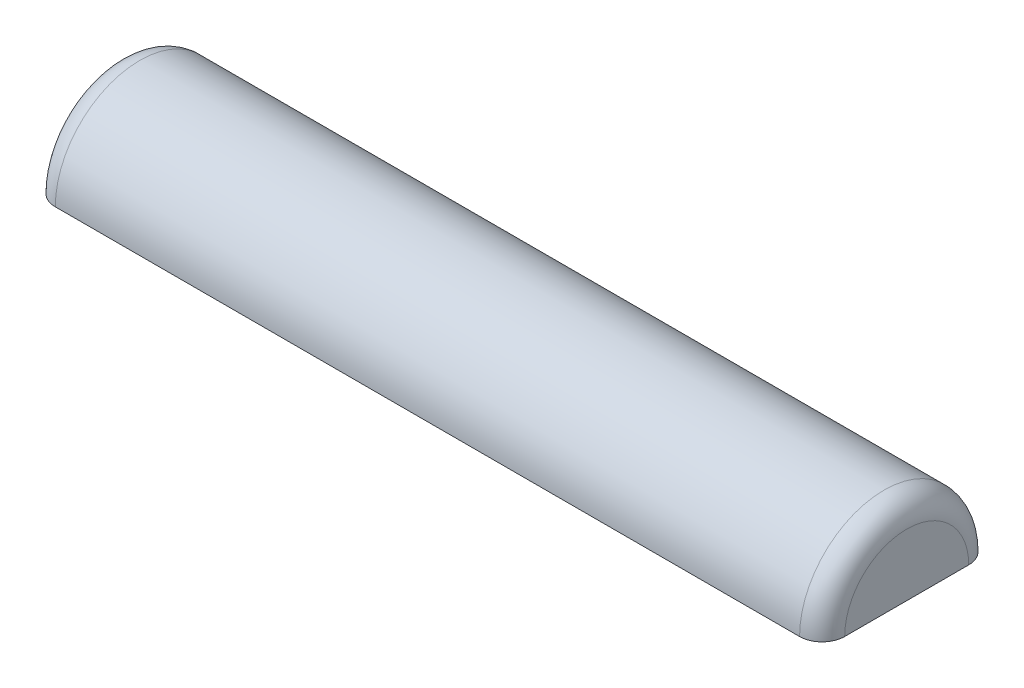
ISO-10303-21;
HEADER;
FILE_DESCRIPTION(('STEP AP214'),'2;1');
FILE_NAME('part.step','',(''),(''),'','','');
FILE_SCHEMA(('AUTOMOTIVE_DESIGN { 1 0 10303 214 1 1 1 1 }'));
ENDSEC;
DATA;
#1=APPLICATION_CONTEXT('core data for automotive mechanical design processes');
#2=APPLICATION_PROTOCOL_DEFINITION('international standard','automotive_design',2000,#1);
#3=PRODUCT_CONTEXT('',#1,'mechanical');
#4=PRODUCT('Part','Part','',(#3));
#5=PRODUCT_RELATED_PRODUCT_CATEGORY('part','',(#4));
#6=PRODUCT_DEFINITION_FORMATION('','',#4);
#7=PRODUCT_DEFINITION_CONTEXT('part definition',#1,'design');
#8=PRODUCT_DEFINITION('design','',#6,#7);
#9=PRODUCT_DEFINITION_SHAPE('','',#8);
#10=(LENGTH_UNIT() NAMED_UNIT(*) SI_UNIT(.MILLI.,.METRE.));
#11=(NAMED_UNIT(*) PLANE_ANGLE_UNIT() SI_UNIT($,.RADIAN.));
#12=(NAMED_UNIT(*) SI_UNIT($,.STERADIAN.) SOLID_ANGLE_UNIT());
#13=UNCERTAINTY_MEASURE_WITH_UNIT(LENGTH_MEASURE(1.E-05),#10,'distance_accuracy_value','');
#14=(GEOMETRIC_REPRESENTATION_CONTEXT(3) GLOBAL_UNCERTAINTY_ASSIGNED_CONTEXT((#13)) GLOBAL_UNIT_ASSIGNED_CONTEXT((#10,
#11,#12)) REPRESENTATION_CONTEXT('',''));
#15=CARTESIAN_POINT('',(0.,0.,0.));
#16=DIRECTION('',(0.,0.,1.));
#17=DIRECTION('',(1.,0.,0.));
#18=AXIS2_PLACEMENT_3D('',#15,#16,#17);
#19=CARTESIAN_POINT('',(0.7,0.,-0.075));
#20=DIRECTION('',(-1.,0.,0.));
#21=DIRECTION('',(0.,0.,1.));
#22=AXIS2_PLACEMENT_3D('',#19,#20,#21);
#23=CYLINDRICAL_SURFACE('',#22,0.075);
#24=DIRECTION('',(-1.,0.,0.));
#25=VECTOR('',#24,1.);
#26=CARTESIAN_POINT('',(0.7,0.,0.));
#27=LINE('',#26,#25);
#28=CARTESIAN_POINT('',(0.68,0.,0.));
#29=VERTEX_POINT('',#28);
#30=CARTESIAN_POINT('',(0.0200000000000001,0.,0.));
#31=VERTEX_POINT('',#30);
#32=EDGE_CURVE('E96',#29,#31,#27,.T.);
#33=ORIENTED_EDGE('',*,*,#32,.F.);
#34=CARTESIAN_POINT('',(0.68,0.,-0.075));
#35=DIRECTION('',(-1.,0.,0.));
#36=DIRECTION('',(0.,0.,1.));
#37=AXIS2_PLACEMENT_3D('',#34,#35,#36);
#38=CIRCLE('',#37,0.075);
#39=CARTESIAN_POINT('',(0.68,0.,-0.15));
#40=VERTEX_POINT('',#39);
#41=EDGE_CURVE('E48',#29,#40,#38,.T.);
#42=ORIENTED_EDGE('',*,*,#41,.T.);
#43=DIRECTION('',(-1.,0.,0.));
#44=VECTOR('',#43,1.);
#45=CARTESIAN_POINT('',(0.7,0.,-0.15));
#46=LINE('',#45,#44);
#47=CARTESIAN_POINT('',(0.0200000000000001,0.,-0.15));
#48=VERTEX_POINT('',#47);
#49=EDGE_CURVE('E101',#40,#48,#46,.T.);
#50=ORIENTED_EDGE('',*,*,#49,.T.);
#51=CARTESIAN_POINT('',(0.0200000000000001,0.,-0.075));
#52=DIRECTION('',(-1.,0.,0.));
#53=DIRECTION('',(0.,0.,1.));
#54=AXIS2_PLACEMENT_3D('',#51,#52,#53);
#55=CIRCLE('',#54,0.075);
#56=EDGE_CURVE('E87',#48,#31,#55,.F.);
#57=ORIENTED_EDGE('',*,*,#56,.T.);
#58=EDGE_LOOP('',(#33,#42,#50,#57));
#59=FACE_BOUND('',#58,.T.);
#60=ADVANCED_FACE('F39',(#59),#23,.T.);
#61=CARTESIAN_POINT('',(0.7,0.,0.));
#62=DIRECTION('',(0.,1.,0.));
#63=DIRECTION('',(0.,0.,1.));
#64=AXIS2_PLACEMENT_3D('',#61,#62,#63);
#65=PLANE('',#64);
#66=DIRECTION('',(0.,0.,-1.));
#67=VECTOR('',#66,1.);
#68=CARTESIAN_POINT('',(0.7,0.,0.));
#69=LINE('',#68,#67);
#70=CARTESIAN_POINT('',(0.7,0.,-0.02));
#71=VERTEX_POINT('',#70);
#72=CARTESIAN_POINT('',(0.7,0.,-0.13));
#73=VERTEX_POINT('',#72);
#74=EDGE_CURVE('E93',#71,#73,#69,.T.);
#75=ORIENTED_EDGE('',*,*,#74,.F.);
#76=CARTESIAN_POINT('',(0.68,0.,-0.02));
#77=DIRECTION('',(0.,1.,0.));
#78=DIRECTION('',(0.,0.,1.));
#79=AXIS2_PLACEMENT_3D('',#76,#77,#78);
#80=CIRCLE('',#79,0.02);
#81=EDGE_CURVE('E63',#71,#29,#80,.F.);
#82=ORIENTED_EDGE('',*,*,#81,.T.);
#83=ORIENTED_EDGE('',*,*,#32,.T.);
#84=CARTESIAN_POINT('',(0.0200000000000001,0.,-0.02));
#85=DIRECTION('',(0.,1.,0.));
#86=DIRECTION('',(0.,0.,1.));
#87=AXIS2_PLACEMENT_3D('',#84,#85,#86);
#88=CIRCLE('',#87,0.02);
#89=CARTESIAN_POINT('',(0.,0.,-0.02));
#90=VERTEX_POINT('',#89);
#91=EDGE_CURVE('E55',#31,#90,#88,.F.);
#92=ORIENTED_EDGE('',*,*,#91,.T.);
#93=DIRECTION('',(0.,0.,-1.));
#94=VECTOR('',#93,1.);
#95=CARTESIAN_POINT('',(0.,0.,0.));
#96=LINE('',#95,#94);
#97=CARTESIAN_POINT('',(0.,0.,-0.13));
#98=VERTEX_POINT('',#97);
#99=EDGE_CURVE('E102',#90,#98,#96,.T.);
#100=ORIENTED_EDGE('',*,*,#99,.T.);
#101=CARTESIAN_POINT('',(0.0200000000000001,0.,-0.13));
#102=DIRECTION('',(0.,1.,0.));
#103=DIRECTION('',(0.,0.,1.));
#104=AXIS2_PLACEMENT_3D('',#101,#102,#103);
#105=CIRCLE('',#104,0.02);
#106=EDGE_CURVE('E95',#98,#48,#105,.F.);
#107=ORIENTED_EDGE('',*,*,#106,.T.);
#108=ORIENTED_EDGE('',*,*,#49,.F.);
#109=CARTESIAN_POINT('',(0.68,0.,-0.13));
#110=DIRECTION('',(0.,1.,0.));
#111=DIRECTION('',(0.,0.,1.));
#112=AXIS2_PLACEMENT_3D('',#109,#110,#111);
#113=CIRCLE('',#112,0.02);
#114=EDGE_CURVE('E88',#40,#73,#113,.F.);
#115=ORIENTED_EDGE('',*,*,#114,.T.);
#116=EDGE_LOOP('',(#75,#82,#83,#92,#100,#107,#108,#115));
#117=FACE_BOUND('',#116,.T.);
#118=ADVANCED_FACE('F98',(#117),#65,.F.);
#119=CARTESIAN_POINT('',(0.7,0.,-0.075));
#120=DIRECTION('',(-1.,0.,0.));
#121=DIRECTION('',(0.,0.,1.));
#122=AXIS2_PLACEMENT_3D('',#119,#120,#121);
#123=PLANE('',#122);
#124=ORIENTED_EDGE('',*,*,#74,.T.);
#125=CARTESIAN_POINT('',(0.7,0.,-0.075));
#126=DIRECTION('',(-1.,0.,0.));
#127=DIRECTION('',(0.,0.,1.));
#128=AXIS2_PLACEMENT_3D('',#125,#126,#127);
#129=CIRCLE('',#128,0.055);
#130=EDGE_CURVE('E85',#73,#71,#129,.F.);
#131=ORIENTED_EDGE('',*,*,#130,.T.);
#132=EDGE_LOOP('',(#124,#131));
#133=FACE_BOUND('',#132,.T.);
#134=ADVANCED_FACE('F92',(#133),#123,.F.);
#135=CARTESIAN_POINT('',(0.,0.,-0.075));
#136=DIRECTION('',(-1.,0.,0.));
#137=DIRECTION('',(0.,0.,1.));
#138=AXIS2_PLACEMENT_3D('',#135,#136,#137);
#139=PLANE('',#138);
#140=ORIENTED_EDGE('',*,*,#99,.F.);
#141=CARTESIAN_POINT('',(0.,0.,-0.075));
#142=DIRECTION('',(-1.,0.,0.));
#143=DIRECTION('',(0.,0.,1.));
#144=AXIS2_PLACEMENT_3D('',#141,#142,#143);
#145=CIRCLE('',#144,0.055);
#146=EDGE_CURVE('E11',#90,#98,#145,.T.);
#147=ORIENTED_EDGE('',*,*,#146,.T.);
#148=EDGE_LOOP('',(#140,#147));
#149=FACE_BOUND('',#148,.T.);
#150=ADVANCED_FACE('F125',(#149),#139,.T.);
#151=CARTESIAN_POINT('',(0.68,0.,-0.075));
#152=DIRECTION('',(-1.,0.,0.));
#153=DIRECTION('',(0.,0.,1.));
#154=AXIS2_PLACEMENT_3D('',#151,#152,#153);
#155=TOROIDAL_SURFACE('',#154,0.055,0.02);
#156=ORIENTED_EDGE('',*,*,#114,.F.);
#157=ORIENTED_EDGE('',*,*,#41,.F.);
#158=ORIENTED_EDGE('',*,*,#81,.F.);
#159=ORIENTED_EDGE('',*,*,#130,.F.);
#160=EDGE_LOOP('',(#156,#157,#158,#159));
#161=FACE_BOUND('',#160,.T.);
#162=ADVANCED_FACE('F84',(#161),#155,.T.);
#163=CARTESIAN_POINT('',(0.0200000000000001,0.,-0.075));
#164=DIRECTION('',(-1.,0.,0.));
#165=DIRECTION('',(0.,0.,1.));
#166=AXIS2_PLACEMENT_3D('',#163,#164,#165);
#167=TOROIDAL_SURFACE('',#166,0.055,0.02);
#168=ORIENTED_EDGE('',*,*,#106,.F.);
#169=ORIENTED_EDGE('',*,*,#146,.F.);
#170=ORIENTED_EDGE('',*,*,#91,.F.);
#171=ORIENTED_EDGE('',*,*,#56,.F.);
#172=EDGE_LOOP('',(#168,#169,#170,#171));
#173=FACE_BOUND('',#172,.T.);
#174=ADVANCED_FACE('F41',(#173),#167,.T.);
#175=CLOSED_SHELL('',(#60,#118,#134,#150,#162,#174));
#176=MANIFOLD_SOLID_BREP('B2',#175);
#177=ADVANCED_BREP_SHAPE_REPRESENTATION('',(#18,#176),#14);
#178=SHAPE_DEFINITION_REPRESENTATION(#9,#177);
ENDSEC;
END-ISO-10303-21;
